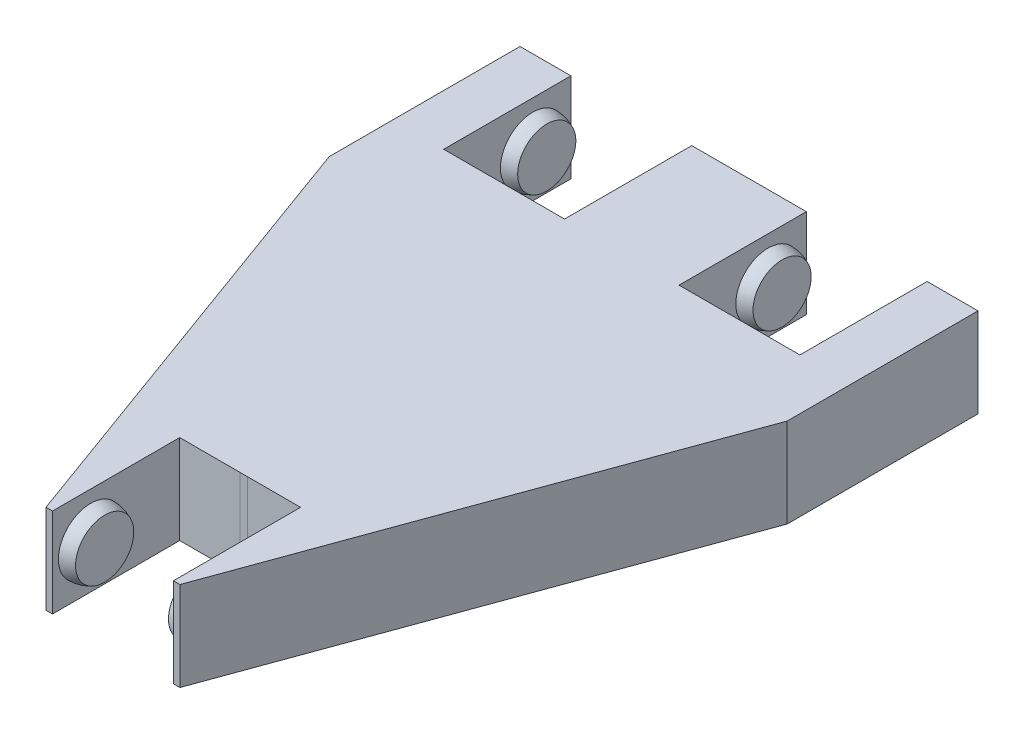
ISO-10303-21;
HEADER;
FILE_DESCRIPTION(('STEP AP214'),'2;1');
FILE_NAME('part.step','',(''),(''),'','','');
FILE_SCHEMA(('AUTOMOTIVE_DESIGN { 1 0 10303 214 1 1 1 1 }'));
ENDSEC;
DATA;
#1=APPLICATION_CONTEXT('core data for automotive mechanical design processes');
#2=APPLICATION_PROTOCOL_DEFINITION('international standard','automotive_design',2000,#1);
#3=PRODUCT_CONTEXT('',#1,'mechanical');
#4=PRODUCT('Part','Part','',(#3));
#5=PRODUCT_RELATED_PRODUCT_CATEGORY('part','',(#4));
#6=PRODUCT_DEFINITION_FORMATION('','',#4);
#7=PRODUCT_DEFINITION_CONTEXT('part definition',#1,'design');
#8=PRODUCT_DEFINITION('design','',#6,#7);
#9=PRODUCT_DEFINITION_SHAPE('','',#8);
#10=(LENGTH_UNIT() NAMED_UNIT(*) SI_UNIT(.MILLI.,.METRE.));
#11=(NAMED_UNIT(*) PLANE_ANGLE_UNIT() SI_UNIT($,.RADIAN.));
#12=(NAMED_UNIT(*) SI_UNIT($,.STERADIAN.) SOLID_ANGLE_UNIT());
#13=UNCERTAINTY_MEASURE_WITH_UNIT(LENGTH_MEASURE(1.E-05),#10,'distance_accuracy_value','');
#14=(GEOMETRIC_REPRESENTATION_CONTEXT(3) GLOBAL_UNCERTAINTY_ASSIGNED_CONTEXT((#13)) GLOBAL_UNIT_ASSIGNED_CONTEXT((#10,
#11,#12)) REPRESENTATION_CONTEXT('',''));
#15=CARTESIAN_POINT('',(0.,0.,0.));
#16=DIRECTION('',(0.,0.,1.));
#17=DIRECTION('',(1.,0.,0.));
#18=AXIS2_PLACEMENT_3D('',#15,#16,#17);
#19=CARTESIAN_POINT('',(0.,14.0277716506636,-30.));
#20=DIRECTION('',(0.,0.,-1.));
#21=DIRECTION('',(-1.,0.,0.));
#22=AXIS2_PLACEMENT_3D('',#19,#20,#21);
#23=PLANE('',#22);
#24=DIRECTION('',(1.,0.,0.));
#25=VECTOR('',#24,1.);
#26=CARTESIAN_POINT('',(0.,0.,-30.));
#27=LINE('',#26,#25);
#28=CARTESIAN_POINT('',(18.5,0.,-30.));
#29=VERTEX_POINT('',#28);
#30=CARTESIAN_POINT('',(28.,0.,-30.));
#31=VERTEX_POINT('',#30);
#32=EDGE_CURVE('E369',#29,#31,#27,.T.);
#33=ORIENTED_EDGE('',*,*,#32,.F.);
#34=DIRECTION('',(0.,-1.,0.));
#35=VECTOR('',#34,1.);
#36=CARTESIAN_POINT('',(18.5,0.,-30.));
#37=LINE('',#36,#35);
#38=CARTESIAN_POINT('',(18.5,14.0277716506636,-30.));
#39=VERTEX_POINT('',#38);
#40=EDGE_CURVE('E56',#39,#29,#37,.T.);
#41=ORIENTED_EDGE('',*,*,#40,.F.);
#42=DIRECTION('',(1.,0.,0.));
#43=VECTOR('',#42,1.);
#44=CARTESIAN_POINT('',(0.,14.0277716506636,-30.));
#45=LINE('',#44,#43);
#46=CARTESIAN_POINT('',(28.,14.0277716506636,-30.));
#47=VERTEX_POINT('',#46);
#48=EDGE_CURVE('E328',#39,#47,#45,.T.);
#49=ORIENTED_EDGE('',*,*,#48,.T.);
#50=DIRECTION('',(0.,-1.,0.));
#51=VECTOR('',#50,1.);
#52=CARTESIAN_POINT('',(28.,14.0277716506636,-30.));
#53=LINE('',#52,#51);
#54=EDGE_CURVE('E406',#47,#31,#53,.T.);
#55=ORIENTED_EDGE('',*,*,#54,.T.);
#56=EDGE_LOOP('',(#33,#41,#49,#55));
#57=FACE_BOUND('',#56,.T.);
#58=ADVANCED_FACE('F38',(#57),#23,.T.);
#59=CARTESIAN_POINT('',(8.99999999999998,14.0277716506636,-30.));
#60=VERTEX_POINT('',#59);
#61=CARTESIAN_POINT('',(16.6931524825552,14.0277716506636,-30.));
#62=VERTEX_POINT('',#61);
#63=EDGE_CURVE('E329',#60,#62,#45,.T.);
#64=ORIENTED_EDGE('',*,*,#63,.T.);
#65=DIRECTION('',(0.,1.,0.));
#66=VECTOR('',#65,1.);
#67=CARTESIAN_POINT('',(16.6931524825552,0.,-30.));
#68=LINE('',#67,#66);
#69=CARTESIAN_POINT('',(16.6931524825552,0.,-30.));
#70=VERTEX_POINT('',#69);
#71=EDGE_CURVE('E245',#70,#62,#68,.T.);
#72=ORIENTED_EDGE('',*,*,#71,.F.);
#73=CARTESIAN_POINT('',(8.99999999999998,0.,-30.));
#74=VERTEX_POINT('',#73);
#75=EDGE_CURVE('E370',#74,#70,#27,.T.);
#76=ORIENTED_EDGE('',*,*,#75,.F.);
#77=DIRECTION('',(0.,-1.,0.));
#78=VECTOR('',#77,1.);
#79=CARTESIAN_POINT('',(8.99999999999998,14.0277716506636,-30.));
#80=LINE('',#79,#78);
#81=EDGE_CURVE('E404',#60,#74,#80,.T.);
#82=ORIENTED_EDGE('',*,*,#81,.F.);
#83=EDGE_LOOP('',(#64,#72,#76,#82));
#84=FACE_BOUND('',#83,.T.);
#85=ADVANCED_FACE('F475',(#84),#23,.T.);
#86=CARTESIAN_POINT('',(0.,14.0277716506636,30.));
#87=DIRECTION('',(0.,0.,-1.));
#88=DIRECTION('',(-1.,0.,0.));
#89=AXIS2_PLACEMENT_3D('',#86,#87,#88);
#90=PLANE('',#89);
#91=DIRECTION('',(0.,-1.,0.));
#92=VECTOR('',#91,1.);
#93=CARTESIAN_POINT('',(0.,0.,30.));
#94=LINE('',#93,#92);
#95=CARTESIAN_POINT('',(0.,14.0277716506636,30.));
#96=VERTEX_POINT('',#95);
#97=CARTESIAN_POINT('',(0.,0.,30.));
#98=VERTEX_POINT('',#97);
#99=EDGE_CURVE('E251',#96,#98,#94,.T.);
#100=ORIENTED_EDGE('',*,*,#99,.F.);
#101=DIRECTION('',(1.,0.,0.));
#102=VECTOR('',#101,1.);
#103=CARTESIAN_POINT('',(0.,14.0277716506636,30.));
#104=LINE('',#103,#102);
#105=CARTESIAN_POINT('',(-9.50000000000001,14.0277716506636,30.));
#106=VERTEX_POINT('',#105);
#107=EDGE_CURVE('E308',#106,#96,#104,.T.);
#108=ORIENTED_EDGE('',*,*,#107,.F.);
#109=DIRECTION('',(0.,-1.,0.));
#110=VECTOR('',#109,1.);
#111=CARTESIAN_POINT('',(-9.50000000000001,14.0277716506636,30.));
#112=LINE('',#111,#110);
#113=CARTESIAN_POINT('',(-9.50000000000001,0.,30.));
#114=VERTEX_POINT('',#113);
#115=EDGE_CURVE('E349',#106,#114,#112,.T.);
#116=ORIENTED_EDGE('',*,*,#115,.T.);
#117=DIRECTION('',(1.,0.,0.));
#118=VECTOR('',#117,1.);
#119=CARTESIAN_POINT('',(0.,0.,30.));
#120=LINE('',#119,#118);
#121=EDGE_CURVE('E350',#114,#98,#120,.T.);
#122=ORIENTED_EDGE('',*,*,#121,.T.);
#123=EDGE_LOOP('',(#100,#108,#116,#122));
#124=FACE_BOUND('',#123,.T.);
#125=ADVANCED_FACE('F533',(#124),#90,.F.);
#126=DIRECTION('',(0.,1.,0.));
#127=VECTOR('',#126,1.);
#128=CARTESIAN_POINT('',(1.17348844516878,0.,30.));
#129=LINE('',#128,#127);
#130=CARTESIAN_POINT('',(1.17348844516878,0.,30.));
#131=VERTEX_POINT('',#130);
#132=CARTESIAN_POINT('',(1.17348844516878,14.0277716506636,30.));
#133=VERTEX_POINT('',#132);
#134=EDGE_CURVE('E261',#131,#133,#129,.T.);
#135=ORIENTED_EDGE('',*,*,#134,.F.);
#136=CARTESIAN_POINT('',(9.49999999999999,0.,30.));
#137=VERTEX_POINT('',#136);
#138=EDGE_CURVE('E307',#131,#137,#120,.T.);
#139=ORIENTED_EDGE('',*,*,#138,.T.);
#140=DIRECTION('',(0.,-1.,0.));
#141=VECTOR('',#140,1.);
#142=CARTESIAN_POINT('',(9.49999999999999,14.0277716506636,30.));
#143=LINE('',#142,#141);
#144=CARTESIAN_POINT('',(9.49999999999999,14.0277716506636,30.));
#145=VERTEX_POINT('',#144);
#146=EDGE_CURVE('E416',#145,#137,#143,.T.);
#147=ORIENTED_EDGE('',*,*,#146,.F.);
#148=EDGE_CURVE('E64',#133,#145,#104,.T.);
#149=ORIENTED_EDGE('',*,*,#148,.F.);
#150=EDGE_LOOP('',(#135,#139,#147,#149));
#151=FACE_BOUND('',#150,.T.);
#152=ADVANCED_FACE('F551',(#151),#90,.F.);
#153=CARTESIAN_POINT('',(0.,14.0277716506636,-50.));
#154=DIRECTION('',(0.,0.,-1.));
#155=DIRECTION('',(-1.,0.,0.));
#156=AXIS2_PLACEMENT_3D('',#153,#154,#155);
#157=PLANE('',#156);
#158=DIRECTION('',(1.,0.,0.));
#159=VECTOR('',#158,1.);
#160=CARTESIAN_POINT('',(0.,14.0277716506636,-50.));
#161=LINE('',#160,#159);
#162=CARTESIAN_POINT('',(-9.00000000000001,14.0277716506636,-50.));
#163=VERTEX_POINT('',#162);
#164=CARTESIAN_POINT('',(0.,14.0277716506636,-50.));
#165=VERTEX_POINT('',#164);
#166=EDGE_CURVE('E325',#163,#165,#161,.T.);
#167=ORIENTED_EDGE('',*,*,#166,.T.);
#168=DIRECTION('',(0.,1.,0.));
#169=VECTOR('',#168,1.);
#170=CARTESIAN_POINT('',(0.,14.0277716506636,-50.));
#171=LINE('',#170,#169);
#172=CARTESIAN_POINT('',(0.,0.,-50.));
#173=VERTEX_POINT('',#172);
#174=EDGE_CURVE('E282',#173,#165,#171,.T.);
#175=ORIENTED_EDGE('',*,*,#174,.F.);
#176=DIRECTION('',(1.,0.,0.));
#177=VECTOR('',#176,1.);
#178=CARTESIAN_POINT('',(0.,0.,-50.));
#179=LINE('',#178,#177);
#180=CARTESIAN_POINT('',(-9.00000000000001,0.,-50.));
#181=VERTEX_POINT('',#180);
#182=EDGE_CURVE('E366',#181,#173,#179,.T.);
#183=ORIENTED_EDGE('',*,*,#182,.F.);
#184=DIRECTION('',(0.,-1.,0.));
#185=VECTOR('',#184,1.);
#186=CARTESIAN_POINT('',(-9.00000000000001,14.0277716506636,-50.));
#187=LINE('',#186,#185);
#188=EDGE_CURVE('E402',#163,#181,#187,.T.);
#189=ORIENTED_EDGE('',*,*,#188,.F.);
#190=EDGE_LOOP('',(#167,#175,#183,#189));
#191=FACE_BOUND('',#190,.T.);
#192=ADVANCED_FACE('F512',(#191),#157,.T.);
#193=CARTESIAN_POINT('',(9.49999999999998,14.0277716506636,0.));
#194=DIRECTION('',(1.,0.,0.));
#195=DIRECTION('',(0.,0.,-1.));
#196=AXIS2_PLACEMENT_3D('',#193,#194,#195);
#197=PLANE('',#196);
#198=CARTESIAN_POINT('',(9.49999999999999,7.,44.));
#199=DIRECTION('',(1.,0.,0.));
#200=DIRECTION('',(0.,0.,-1.));
#201=AXIS2_PLACEMENT_3D('',#198,#199,#200);
#202=CIRCLE('',#201,5.075);
#203=CARTESIAN_POINT('',(9.49999999999999,7.,38.925));
#204=VERTEX_POINT('',#203);
#205=EDGE_CURVE('E48',#204,#204,#202,.F.);
#206=ORIENTED_EDGE('',*,*,#205,.F.);
#207=EDGE_LOOP('',(#206));
#208=FACE_BOUND('',#207,.T.);
#209=DIRECTION('',(0.,0.,1.));
#210=VECTOR('',#209,1.);
#211=CARTESIAN_POINT('',(9.49999999999998,0.,0.));
#212=LINE('',#211,#210);
#213=CARTESIAN_POINT('',(9.49999999999999,0.,50.));
#214=VERTEX_POINT('',#213);
#215=EDGE_CURVE('E352',#137,#214,#212,.T.);
#216=ORIENTED_EDGE('',*,*,#215,.T.);
#217=DIRECTION('',(0.,-1.,0.));
#218=VECTOR('',#217,1.);
#219=CARTESIAN_POINT('',(9.49999999999999,14.0277716506636,50.));
#220=LINE('',#219,#218);
#221=CARTESIAN_POINT('',(9.49999999999999,14.0277716506636,50.));
#222=VERTEX_POINT('',#221);
#223=EDGE_CURVE('E413',#222,#214,#220,.T.);
#224=ORIENTED_EDGE('',*,*,#223,.F.);
#225=DIRECTION('',(0.,0.,1.));
#226=VECTOR('',#225,1.);
#227=CARTESIAN_POINT('',(9.49999999999998,14.0277716506636,0.));
#228=LINE('',#227,#226);
#229=EDGE_CURVE('E311',#145,#222,#228,.T.);
#230=ORIENTED_EDGE('',*,*,#229,.F.);
#231=ORIENTED_EDGE('',*,*,#146,.T.);
#232=EDGE_LOOP('',(#216,#224,#230,#231));
#233=FACE_BOUND('',#232,.T.);
#234=ADVANCED_FACE('F546',(#208,#233),#197,.F.);
#235=CARTESIAN_POINT('',(0.,14.0277716506636,50.));
#236=DIRECTION('',(0.,0.,-1.));
#237=DIRECTION('',(-1.,0.,0.));
#238=AXIS2_PLACEMENT_3D('',#235,#236,#237);
#239=PLANE('',#238);
#240=DIRECTION('',(1.,0.,0.));
#241=VECTOR('',#240,1.);
#242=CARTESIAN_POINT('',(0.,0.,50.));
#243=LINE('',#242,#241);
#244=CARTESIAN_POINT('',(10.5220836013658,0.,50.));
#245=VERTEX_POINT('',#244);
#246=EDGE_CURVE('E354',#214,#245,#243,.T.);
#247=ORIENTED_EDGE('',*,*,#246,.T.);
#248=DIRECTION('',(0.,1.,0.));
#249=VECTOR('',#248,1.);
#250=CARTESIAN_POINT('',(10.5220836013658,14.0277716506636,50.));
#251=LINE('',#250,#249);
#252=CARTESIAN_POINT('',(10.5220836013658,14.0277716506636,50.));
#253=VERTEX_POINT('',#252);
#254=EDGE_CURVE('E424',#245,#253,#251,.T.);
#255=ORIENTED_EDGE('',*,*,#254,.T.);
#256=DIRECTION('',(1.,0.,0.));
#257=VECTOR('',#256,1.);
#258=CARTESIAN_POINT('',(0.,14.0277716506636,50.));
#259=LINE('',#258,#257);
#260=EDGE_CURVE('E313',#222,#253,#259,.T.);
#261=ORIENTED_EDGE('',*,*,#260,.F.);
#262=ORIENTED_EDGE('',*,*,#223,.T.);
#263=EDGE_LOOP('',(#247,#255,#261,#262));
#264=FACE_BOUND('',#263,.T.);
#265=ADVANCED_FACE('F544',(#264),#239,.F.);
#266=CARTESIAN_POINT('',(36.,14.0277716506636,0.));
#267=DIRECTION('',(1.,0.,0.));
#268=DIRECTION('',(0.,0.,-1.));
#269=AXIS2_PLACEMENT_3D('',#266,#267,#268);
#270=PLANE('',#269);
#271=DIRECTION('',(0.,0.,1.));
#272=VECTOR('',#271,1.);
#273=CARTESIAN_POINT('',(36.,14.0277716506636,0.));
#274=LINE('',#273,#272);
#275=CARTESIAN_POINT('',(36.,14.0277716506636,-50.));
#276=VERTEX_POINT('',#275);
#277=CARTESIAN_POINT('',(36.,14.0277716506636,-20.0000000000006));
#278=VERTEX_POINT('',#277);
#279=EDGE_CURVE('E316',#276,#278,#274,.T.);
#280=ORIENTED_EDGE('',*,*,#279,.T.);
#281=DIRECTION('',(0.,-1.,0.));
#282=VECTOR('',#281,1.);
#283=CARTESIAN_POINT('',(36.,0.,-20.0000000000006));
#284=LINE('',#283,#282);
#285=CARTESIAN_POINT('',(36.,0.,-20.0000000000006));
#286=VERTEX_POINT('',#285);
#287=EDGE_CURVE('E419',#278,#286,#284,.T.);
#288=ORIENTED_EDGE('',*,*,#287,.T.);
#289=DIRECTION('',(0.,0.,1.));
#290=VECTOR('',#289,1.);
#291=CARTESIAN_POINT('',(36.,0.,0.));
#292=LINE('',#291,#290);
#293=CARTESIAN_POINT('',(36.,0.,-50.));
#294=VERTEX_POINT('',#293);
#295=EDGE_CURVE('E357',#294,#286,#292,.T.);
#296=ORIENTED_EDGE('',*,*,#295,.F.);
#297=DIRECTION('',(0.,-1.,0.));
#298=VECTOR('',#297,1.);
#299=CARTESIAN_POINT('',(36.,14.0277716506636,-50.));
#300=LINE('',#299,#298);
#301=EDGE_CURVE('E411',#276,#294,#300,.T.);
#302=ORIENTED_EDGE('',*,*,#301,.F.);
#303=EDGE_LOOP('',(#280,#288,#296,#302));
#304=FACE_BOUND('',#303,.T.);
#305=ADVANCED_FACE('F541',(#304),#270,.T.);
#306=CARTESIAN_POINT('',(28.,0.,-50.));
#307=VERTEX_POINT('',#306);
#308=EDGE_CURVE('E361',#307,#294,#179,.T.);
#309=ORIENTED_EDGE('',*,*,#308,.F.);
#310=DIRECTION('',(0.,-1.,0.));
#311=VECTOR('',#310,1.);
#312=CARTESIAN_POINT('',(28.,14.0277716506636,-50.));
#313=LINE('',#312,#311);
#314=CARTESIAN_POINT('',(28.,14.0277716506636,-50.));
#315=VERTEX_POINT('',#314);
#316=EDGE_CURVE('E409',#315,#307,#313,.T.);
#317=ORIENTED_EDGE('',*,*,#316,.F.);
#318=EDGE_CURVE('E320',#315,#276,#161,.T.);
#319=ORIENTED_EDGE('',*,*,#318,.T.);
#320=ORIENTED_EDGE('',*,*,#301,.T.);
#321=EDGE_LOOP('',(#309,#317,#319,#320));
#322=FACE_BOUND('',#321,.T.);
#323=ADVANCED_FACE('F539',(#322),#157,.T.);
#324=CARTESIAN_POINT('',(28.,14.0277716506636,0.));
#325=DIRECTION('',(1.,0.,0.));
#326=DIRECTION('',(0.,0.,-1.));
#327=AXIS2_PLACEMENT_3D('',#324,#325,#326);
#328=PLANE('',#327);
#329=CARTESIAN_POINT('',(28.,7.,-44.));
#330=DIRECTION('',(1.,0.,0.));
#331=DIRECTION('',(0.,0.,-1.));
#332=AXIS2_PLACEMENT_3D('',#329,#330,#331);
#333=CIRCLE('',#332,5.075);
#334=CARTESIAN_POINT('',(28.,7.,-49.075));
#335=VERTEX_POINT('',#334);
#336=EDGE_CURVE('E437',#335,#335,#333,.F.);
#337=ORIENTED_EDGE('',*,*,#336,.F.);
#338=EDGE_LOOP('',(#337));
#339=FACE_BOUND('',#338,.T.);
#340=DIRECTION('',(0.,0.,1.));
#341=VECTOR('',#340,1.);
#342=CARTESIAN_POINT('',(28.,0.,0.));
#343=LINE('',#342,#341);
#344=EDGE_CURVE('E364',#307,#31,#343,.T.);
#345=ORIENTED_EDGE('',*,*,#344,.T.);
#346=ORIENTED_EDGE('',*,*,#54,.F.);
#347=DIRECTION('',(0.,0.,1.));
#348=VECTOR('',#347,1.);
#349=CARTESIAN_POINT('',(28.,14.0277716506636,0.));
#350=LINE('',#349,#348);
#351=EDGE_CURVE('E323',#315,#47,#350,.T.);
#352=ORIENTED_EDGE('',*,*,#351,.F.);
#353=ORIENTED_EDGE('',*,*,#316,.T.);
#354=EDGE_LOOP('',(#345,#346,#352,#353));
#355=FACE_BOUND('',#354,.T.);
#356=ADVANCED_FACE('F536',(#339,#355),#328,.F.);
#357=CARTESIAN_POINT('',(8.99999999999999,14.0277716506636,0.));
#358=DIRECTION('',(1.,0.,0.));
#359=DIRECTION('',(0.,0.,-1.));
#360=AXIS2_PLACEMENT_3D('',#357,#358,#359);
#361=PLANE('',#360);
#362=CARTESIAN_POINT('',(8.99999999999995,7.,-44.));
#363=DIRECTION('',(-1.,0.,0.));
#364=DIRECTION('',(0.,0.,1.));
#365=AXIS2_PLACEMENT_3D('',#362,#363,#364);
#366=CIRCLE('',#365,5.075);
#367=CARTESIAN_POINT('',(8.99999999999995,7.,-38.925));
#368=VERTEX_POINT('',#367);
#369=EDGE_CURVE('E454',#368,#368,#366,.T.);
#370=ORIENTED_EDGE('',*,*,#369,.T.);
#371=EDGE_LOOP('',(#370));
#372=FACE_BOUND('',#371,.T.);
#373=DIRECTION('',(0.,0.,1.));
#374=VECTOR('',#373,1.);
#375=CARTESIAN_POINT('',(8.99999999999999,0.,0.));
#376=LINE('',#375,#374);
#377=CARTESIAN_POINT('',(8.99999999999998,0.,-50.01));
#378=VERTEX_POINT('',#377);
#379=EDGE_CURVE('E372',#378,#74,#376,.T.);
#380=ORIENTED_EDGE('',*,*,#379,.F.);
#381=DIRECTION('',(0.,-1.,0.));
#382=VECTOR('',#381,1.);
#383=CARTESIAN_POINT('',(8.99999999999998,14.0277716506636,-50.01));
#384=LINE('',#383,#382);
#385=CARTESIAN_POINT('',(8.99999999999998,14.0277716506636,-50.01));
#386=VERTEX_POINT('',#385);
#387=EDGE_CURVE('E289',#386,#378,#384,.T.);
#388=ORIENTED_EDGE('',*,*,#387,.F.);
#389=DIRECTION('',(0.,0.,1.));
#390=VECTOR('',#389,1.);
#391=CARTESIAN_POINT('',(8.99999999999999,14.0277716506636,0.));
#392=LINE('',#391,#390);
#393=EDGE_CURVE('E332',#386,#60,#392,.T.);
#394=ORIENTED_EDGE('',*,*,#393,.T.);
#395=ORIENTED_EDGE('',*,*,#81,.T.);
#396=EDGE_LOOP('',(#380,#388,#394,#395));
#397=FACE_BOUND('',#396,.T.);
#398=ADVANCED_FACE('F478',(#372,#397),#361,.T.);
#399=CARTESIAN_POINT('',(-9.00000000000001,14.0277716506636,0.));
#400=DIRECTION('',(1.,0.,0.));
#401=DIRECTION('',(0.,0.,-1.));
#402=AXIS2_PLACEMENT_3D('',#399,#400,#401);
#403=PLANE('',#402);
#404=CARTESIAN_POINT('',(-9.00000000000001,7.,-44.));
#405=DIRECTION('',(1.,0.,0.));
#406=DIRECTION('',(0.,0.,-1.));
#407=AXIS2_PLACEMENT_3D('',#404,#405,#406);
#408=CIRCLE('',#407,5.075);
#409=CARTESIAN_POINT('',(-9.00000000000001,7.,-49.075));
#410=VERTEX_POINT('',#409);
#411=EDGE_CURVE('E11',#410,#410,#408,.F.);
#412=ORIENTED_EDGE('',*,*,#411,.F.);
#413=EDGE_LOOP('',(#412));
#414=FACE_BOUND('',#413,.T.);
#415=DIRECTION('',(0.,0.,1.));
#416=VECTOR('',#415,1.);
#417=CARTESIAN_POINT('',(-9.00000000000001,0.,0.));
#418=LINE('',#417,#416);
#419=CARTESIAN_POINT('',(-9.00000000000001,0.,-30.));
#420=VERTEX_POINT('',#419);
#421=EDGE_CURVE('E375',#181,#420,#418,.T.);
#422=ORIENTED_EDGE('',*,*,#421,.T.);
#423=DIRECTION('',(0.,-1.,0.));
#424=VECTOR('',#423,1.);
#425=CARTESIAN_POINT('',(-9.00000000000001,14.0277716506636,-30.));
#426=LINE('',#425,#424);
#427=CARTESIAN_POINT('',(-9.00000000000001,14.0277716506636,-30.));
#428=VERTEX_POINT('',#427);
#429=EDGE_CURVE('E400',#428,#420,#426,.T.);
#430=ORIENTED_EDGE('',*,*,#429,.F.);
#431=DIRECTION('',(0.,0.,1.));
#432=VECTOR('',#431,1.);
#433=CARTESIAN_POINT('',(-9.00000000000001,14.0277716506636,0.));
#434=LINE('',#433,#432);
#435=EDGE_CURVE('E335',#163,#428,#434,.T.);
#436=ORIENTED_EDGE('',*,*,#435,.F.);
#437=ORIENTED_EDGE('',*,*,#188,.T.);
#438=EDGE_LOOP('',(#422,#430,#436,#437));
#439=FACE_BOUND('',#438,.T.);
#440=ADVANCED_FACE('F514',(#414,#439),#403,.F.);
#441=CARTESIAN_POINT('',(0.,14.0277716506636,-30.));
#442=DIRECTION('',(0.,0.,-1.));
#443=DIRECTION('',(-1.,0.,0.));
#444=AXIS2_PLACEMENT_3D('',#441,#442,#443);
#445=PLANE('',#444);
#446=DIRECTION('',(1.,0.,0.));
#447=VECTOR('',#446,1.);
#448=CARTESIAN_POINT('',(0.,0.,-30.));
#449=LINE('',#448,#447);
#450=CARTESIAN_POINT('',(-28.,0.,-30.));
#451=VERTEX_POINT('',#450);
#452=EDGE_CURVE('E378',#451,#420,#449,.T.);
#453=ORIENTED_EDGE('',*,*,#452,.F.);
#454=DIRECTION('',(0.,-1.,0.));
#455=VECTOR('',#454,1.);
#456=CARTESIAN_POINT('',(-28.,14.0277716506636,-30.));
#457=LINE('',#456,#455);
#458=CARTESIAN_POINT('',(-28.,14.0277716506636,-30.));
#459=VERTEX_POINT('',#458);
#460=EDGE_CURVE('E398',#459,#451,#457,.T.);
#461=ORIENTED_EDGE('',*,*,#460,.F.);
#462=DIRECTION('',(1.,0.,0.));
#463=VECTOR('',#462,1.);
#464=CARTESIAN_POINT('',(0.,14.0277716506636,-30.));
#465=LINE('',#464,#463);
#466=EDGE_CURVE('E337',#459,#428,#465,.T.);
#467=ORIENTED_EDGE('',*,*,#466,.T.);
#468=ORIENTED_EDGE('',*,*,#429,.T.);
#469=EDGE_LOOP('',(#453,#461,#467,#468));
#470=FACE_BOUND('',#469,.T.);
#471=ADVANCED_FACE('F516',(#470),#445,.T.);
#472=CARTESIAN_POINT('',(-28.,14.0277716506636,0.));
#473=DIRECTION('',(1.,0.,0.));
#474=DIRECTION('',(0.,0.,-1.));
#475=AXIS2_PLACEMENT_3D('',#472,#473,#474);
#476=PLANE('',#475);
#477=CARTESIAN_POINT('',(-28.,7.,-44.));
#478=DIRECTION('',(-1.,0.,0.));
#479=DIRECTION('',(0.,0.,1.));
#480=AXIS2_PLACEMENT_3D('',#477,#478,#479);
#481=CIRCLE('',#480,5.075);
#482=CARTESIAN_POINT('',(-28.,7.,-38.925));
#483=VERTEX_POINT('',#482);
#484=EDGE_CURVE('E300',#483,#483,#481,.T.);
#485=ORIENTED_EDGE('',*,*,#484,.T.);
#486=EDGE_LOOP('',(#485));
#487=FACE_BOUND('',#486,.T.);
#488=DIRECTION('',(0.,0.,1.));
#489=VECTOR('',#488,1.);
#490=CARTESIAN_POINT('',(-28.,0.,0.));
#491=LINE('',#490,#489);
#492=CARTESIAN_POINT('',(-28.,0.,-50.));
#493=VERTEX_POINT('',#492);
#494=EDGE_CURVE('E381',#493,#451,#491,.T.);
#495=ORIENTED_EDGE('',*,*,#494,.F.);
#496=DIRECTION('',(0.,-1.,0.));
#497=VECTOR('',#496,1.);
#498=CARTESIAN_POINT('',(-28.,14.0277716506636,-50.));
#499=LINE('',#498,#497);
#500=CARTESIAN_POINT('',(-28.,14.0277716506636,-50.));
#501=VERTEX_POINT('',#500);
#502=EDGE_CURVE('E396',#501,#493,#499,.T.);
#503=ORIENTED_EDGE('',*,*,#502,.F.);
#504=DIRECTION('',(0.,0.,1.));
#505=VECTOR('',#504,1.);
#506=CARTESIAN_POINT('',(-28.,14.0277716506636,0.));
#507=LINE('',#506,#505);
#508=EDGE_CURVE('E340',#501,#459,#507,.T.);
#509=ORIENTED_EDGE('',*,*,#508,.T.);
#510=ORIENTED_EDGE('',*,*,#460,.T.);
#511=EDGE_LOOP('',(#495,#503,#509,#510));
#512=FACE_BOUND('',#511,.T.);
#513=ADVANCED_FACE('F505',(#487,#512),#476,.T.);
#514=CARTESIAN_POINT('',(-36.,0.,-50.));
#515=VERTEX_POINT('',#514);
#516=EDGE_CURVE('E365',#515,#493,#179,.T.);
#517=ORIENTED_EDGE('',*,*,#516,.F.);
#518=DIRECTION('',(0.,-1.,0.));
#519=VECTOR('',#518,1.);
#520=CARTESIAN_POINT('',(-36.,14.0277716506636,-50.));
#521=LINE('',#520,#519);
#522=CARTESIAN_POINT('',(-36.,14.0277716506636,-50.));
#523=VERTEX_POINT('',#522);
#524=EDGE_CURVE('E394',#523,#515,#521,.T.);
#525=ORIENTED_EDGE('',*,*,#524,.F.);
#526=EDGE_CURVE('E324',#523,#501,#161,.T.);
#527=ORIENTED_EDGE('',*,*,#526,.T.);
#528=ORIENTED_EDGE('',*,*,#502,.T.);
#529=EDGE_LOOP('',(#517,#525,#527,#528));
#530=FACE_BOUND('',#529,.T.);
#531=ADVANCED_FACE('F499',(#530),#157,.T.);
#532=CARTESIAN_POINT('',(-36.,14.0277716506636,0.));
#533=DIRECTION('',(1.,0.,0.));
#534=DIRECTION('',(0.,0.,-1.));
#535=AXIS2_PLACEMENT_3D('',#532,#533,#534);
#536=PLANE('',#535);
#537=DIRECTION('',(0.,0.,1.));
#538=VECTOR('',#537,1.);
#539=CARTESIAN_POINT('',(-36.,0.,0.));
#540=LINE('',#539,#538);
#541=CARTESIAN_POINT('',(-36.,0.,-20.0000000000007));
#542=VERTEX_POINT('',#541);
#543=EDGE_CURVE('E384',#515,#542,#540,.T.);
#544=ORIENTED_EDGE('',*,*,#543,.T.);
#545=DIRECTION('',(0.,1.,0.));
#546=VECTOR('',#545,1.);
#547=CARTESIAN_POINT('',(-36.,14.0277716506636,-20.0000000000007));
#548=LINE('',#547,#546);
#549=CARTESIAN_POINT('',(-36.,14.0277716506636,-20.0000000000007));
#550=VERTEX_POINT('',#549);
#551=EDGE_CURVE('E433',#542,#550,#548,.T.);
#552=ORIENTED_EDGE('',*,*,#551,.T.);
#553=DIRECTION('',(0.,0.,1.));
#554=VECTOR('',#553,1.);
#555=CARTESIAN_POINT('',(-36.,14.0277716506636,0.));
#556=LINE('',#555,#554);
#557=EDGE_CURVE('E343',#523,#550,#556,.T.);
#558=ORIENTED_EDGE('',*,*,#557,.F.);
#559=ORIENTED_EDGE('',*,*,#524,.T.);
#560=EDGE_LOOP('',(#544,#552,#558,#559));
#561=FACE_BOUND('',#560,.T.);
#562=ADVANCED_FACE('F612',(#561),#536,.F.);
#563=CARTESIAN_POINT('',(-10.5220836013658,14.0277716506636,50.));
#564=VERTEX_POINT('',#563);
#565=CARTESIAN_POINT('',(-9.50000000000001,14.0277716506636,50.));
#566=VERTEX_POINT('',#565);
#567=EDGE_CURVE('E317',#564,#566,#259,.T.);
#568=ORIENTED_EDGE('',*,*,#567,.F.);
#569=DIRECTION('',(0.,-1.,0.));
#570=VECTOR('',#569,1.);
#571=CARTESIAN_POINT('',(-10.5220836013658,14.0277716506636,50.));
#572=LINE('',#571,#570);
#573=CARTESIAN_POINT('',(-10.5220836013658,0.,50.));
#574=VERTEX_POINT('',#573);
#575=EDGE_CURVE('E428',#564,#574,#572,.T.);
#576=ORIENTED_EDGE('',*,*,#575,.T.);
#577=CARTESIAN_POINT('',(-9.50000000000001,0.,50.));
#578=VERTEX_POINT('',#577);
#579=EDGE_CURVE('E358',#574,#578,#243,.T.);
#580=ORIENTED_EDGE('',*,*,#579,.T.);
#581=DIRECTION('',(0.,-1.,0.));
#582=VECTOR('',#581,1.);
#583=CARTESIAN_POINT('',(-9.50000000000001,14.0277716506636,50.));
#584=LINE('',#583,#582);
#585=EDGE_CURVE('E391',#566,#578,#584,.T.);
#586=ORIENTED_EDGE('',*,*,#585,.F.);
#587=EDGE_LOOP('',(#568,#576,#580,#586));
#588=FACE_BOUND('',#587,.T.);
#589=ADVANCED_FACE('F608',(#588),#239,.F.);
#590=CARTESIAN_POINT('',(-9.50000000000002,14.0277716506636,0.));
#591=DIRECTION('',(1.,0.,0.));
#592=DIRECTION('',(0.,0.,-1.));
#593=AXIS2_PLACEMENT_3D('',#590,#591,#592);
#594=PLANE('',#593);
#595=CARTESIAN_POINT('',(-9.50000000000001,7.,44.));
#596=DIRECTION('',(-1.,0.,0.));
#597=DIRECTION('',(0.,0.,-1.));
#598=AXIS2_PLACEMENT_3D('',#595,#596,#597);
#599=CIRCLE('',#598,5.075);
#600=CARTESIAN_POINT('',(-9.50000000000001,7.,38.925));
#601=VERTEX_POINT('',#600);
#602=EDGE_CURVE('E304',#601,#601,#599,.T.);
#603=ORIENTED_EDGE('',*,*,#602,.T.);
#604=EDGE_LOOP('',(#603));
#605=FACE_BOUND('',#604,.T.);
#606=DIRECTION('',(0.,0.,1.));
#607=VECTOR('',#606,1.);
#608=CARTESIAN_POINT('',(-9.50000000000002,0.,0.));
#609=LINE('',#608,#607);
#610=EDGE_CURVE('E387',#114,#578,#609,.T.);
#611=ORIENTED_EDGE('',*,*,#610,.F.);
#612=ORIENTED_EDGE('',*,*,#115,.F.);
#613=DIRECTION('',(0.,0.,1.));
#614=VECTOR('',#613,1.);
#615=CARTESIAN_POINT('',(-9.50000000000002,14.0277716506636,0.));
#616=LINE('',#615,#614);
#617=EDGE_CURVE('E346',#106,#566,#616,.T.);
#618=ORIENTED_EDGE('',*,*,#617,.T.);
#619=ORIENTED_EDGE('',*,*,#585,.T.);
#620=EDGE_LOOP('',(#611,#612,#618,#619));
#621=FACE_BOUND('',#620,.T.);
#622=ADVANCED_FACE('F606',(#605,#621),#594,.T.);
#623=CARTESIAN_POINT('',(0.,14.0277716506636,0.));
#624=DIRECTION('',(0.,1.,0.));
#625=DIRECTION('',(0.,0.,1.));
#626=AXIS2_PLACEMENT_3D('',#623,#624,#625);
#627=PLANE('',#626);
#628=ORIENTED_EDGE('',*,*,#557,.T.);
#629=DIRECTION('',(-0.342020143325666,0.,-0.939692620785909));
#630=VECTOR('',#629,1.);
#631=CARTESIAN_POINT('',(-25.3609238792761,14.0277716506636,9.23062140554737));
#632=LINE('',#631,#630);
#633=EDGE_CURVE('E435',#550,#564,#632,.F.);
#634=ORIENTED_EDGE('',*,*,#633,.T.);
#635=ORIENTED_EDGE('',*,*,#567,.T.);
#636=ORIENTED_EDGE('',*,*,#617,.F.);
#637=ORIENTED_EDGE('',*,*,#107,.T.);
#638=DIRECTION('',(0.,0.,-1.));
#639=VECTOR('',#638,1.);
#640=CARTESIAN_POINT('',(0.,14.0277716506636,30.01));
#641=LINE('',#640,#639);
#642=CARTESIAN_POINT('',(0.,14.0277716506636,30.01));
#643=VERTEX_POINT('',#642);
#644=EDGE_CURVE('E267',#643,#96,#641,.T.);
#645=ORIENTED_EDGE('',*,*,#644,.F.);
#646=DIRECTION('',(-1.,0.,0.));
#647=VECTOR('',#646,1.);
#648=CARTESIAN_POINT('',(0.,14.0277716506636,30.01));
#649=LINE('',#648,#647);
#650=CARTESIAN_POINT('',(1.17348844516878,14.0277716506636,30.01));
#651=VERTEX_POINT('',#650);
#652=EDGE_CURVE('E265',#651,#643,#649,.T.);
#653=ORIENTED_EDGE('',*,*,#652,.F.);
#654=DIRECTION('',(0.,0.,-1.));
#655=VECTOR('',#654,1.);
#656=CARTESIAN_POINT('',(1.17348844516878,14.0277716506636,30.01));
#657=LINE('',#656,#655);
#658=EDGE_CURVE('E273',#651,#133,#657,.T.);
#659=ORIENTED_EDGE('',*,*,#658,.T.);
#660=ORIENTED_EDGE('',*,*,#148,.T.);
#661=ORIENTED_EDGE('',*,*,#229,.T.);
#662=ORIENTED_EDGE('',*,*,#260,.T.);
#663=DIRECTION('',(0.342020143325666,0.,-0.93969262078591));
#664=VECTOR('',#663,1.);
#665=CARTESIAN_POINT('',(25.3609238792761,14.0277716506636,9.23062140554737));
#666=LINE('',#665,#664);
#667=EDGE_CURVE('E426',#253,#278,#666,.T.);
#668=ORIENTED_EDGE('',*,*,#667,.T.);
#669=ORIENTED_EDGE('',*,*,#279,.F.);
#670=ORIENTED_EDGE('',*,*,#318,.F.);
#671=ORIENTED_EDGE('',*,*,#351,.T.);
#672=ORIENTED_EDGE('',*,*,#48,.F.);
#673=DIRECTION('',(0.,0.,1.));
#674=VECTOR('',#673,1.);
#675=CARTESIAN_POINT('',(18.5,14.0277716506636,-30.01));
#676=LINE('',#675,#674);
#677=CARTESIAN_POINT('',(18.5,14.0277716506636,-30.01));
#678=VERTEX_POINT('',#677);
#679=EDGE_CURVE('E464',#678,#39,#676,.T.);
#680=ORIENTED_EDGE('',*,*,#679,.F.);
#681=DIRECTION('',(1.,0.,0.));
#682=VECTOR('',#681,1.);
#683=CARTESIAN_POINT('',(18.5,14.0277716506636,-30.01));
#684=LINE('',#683,#682);
#685=CARTESIAN_POINT('',(16.6931524825552,14.0277716506636,-30.01));
#686=VERTEX_POINT('',#685);
#687=EDGE_CURVE('E243',#686,#678,#684,.T.);
#688=ORIENTED_EDGE('',*,*,#687,.F.);
#689=DIRECTION('',(0.,0.,1.));
#690=VECTOR('',#689,1.);
#691=CARTESIAN_POINT('',(16.6931524825552,14.0277716506636,-30.01));
#692=LINE('',#691,#690);
#693=EDGE_CURVE('E253',#686,#62,#692,.T.);
#694=ORIENTED_EDGE('',*,*,#693,.T.);
#695=ORIENTED_EDGE('',*,*,#63,.F.);
#696=ORIENTED_EDGE('',*,*,#393,.F.);
#697=DIRECTION('',(1.,0.,0.));
#698=VECTOR('',#697,1.);
#699=CARTESIAN_POINT('',(0.,14.0277716506636,-50.01));
#700=LINE('',#699,#698);
#701=CARTESIAN_POINT('',(0.,14.0277716506636,-50.01));
#702=VERTEX_POINT('',#701);
#703=EDGE_CURVE('E286',#702,#386,#700,.T.);
#704=ORIENTED_EDGE('',*,*,#703,.F.);
#705=DIRECTION('',(0.,0.,1.));
#706=VECTOR('',#705,1.);
#707=CARTESIAN_POINT('',(0.,14.0277716506636,-50.01));
#708=LINE('',#707,#706);
#709=EDGE_CURVE('E298',#702,#165,#708,.T.);
#710=ORIENTED_EDGE('',*,*,#709,.T.);
#711=ORIENTED_EDGE('',*,*,#166,.F.);
#712=ORIENTED_EDGE('',*,*,#435,.T.);
#713=ORIENTED_EDGE('',*,*,#466,.F.);
#714=ORIENTED_EDGE('',*,*,#508,.F.);
#715=ORIENTED_EDGE('',*,*,#526,.F.);
#716=EDGE_LOOP('',(#628,#634,#635,#636,#637,#645,#653,#659,#660,#661,#662,#668,#669,#670,#671,
#672,#680,#688,#694,#695,#696,#704,#710,#711,#712,#713,#714,#715));
#717=FACE_BOUND('',#716,.T.);
#718=ADVANCED_FACE('F471',(#717),#627,.T.);
#719=CARTESIAN_POINT('',(0.,0.,0.));
#720=DIRECTION('',(0.,1.,0.));
#721=DIRECTION('',(0.,0.,1.));
#722=AXIS2_PLACEMENT_3D('',#719,#720,#721);
#723=PLANE('',#722);
#724=ORIENTED_EDGE('',*,*,#579,.F.);
#725=DIRECTION('',(0.342020143325666,0.,0.939692620785909));
#726=VECTOR('',#725,1.);
#727=CARTESIAN_POINT('',(-10.5220836013658,0.,50.));
#728=LINE('',#727,#726);
#729=EDGE_CURVE('E431',#574,#542,#728,.F.);
#730=ORIENTED_EDGE('',*,*,#729,.T.);
#731=ORIENTED_EDGE('',*,*,#543,.F.);
#732=ORIENTED_EDGE('',*,*,#516,.T.);
#733=ORIENTED_EDGE('',*,*,#494,.T.);
#734=ORIENTED_EDGE('',*,*,#452,.T.);
#735=ORIENTED_EDGE('',*,*,#421,.F.);
#736=ORIENTED_EDGE('',*,*,#182,.T.);
#737=DIRECTION('',(0.,0.,1.));
#738=VECTOR('',#737,1.);
#739=CARTESIAN_POINT('',(0.,0.,-50.01));
#740=LINE('',#739,#738);
#741=CARTESIAN_POINT('',(0.,0.,-50.01));
#742=VERTEX_POINT('',#741);
#743=EDGE_CURVE('E294',#742,#173,#740,.T.);
#744=ORIENTED_EDGE('',*,*,#743,.F.);
#745=DIRECTION('',(-1.,0.,0.));
#746=VECTOR('',#745,1.);
#747=CARTESIAN_POINT('',(0.,0.,-50.01));
#748=LINE('',#747,#746);
#749=EDGE_CURVE('E292',#378,#742,#748,.T.);
#750=ORIENTED_EDGE('',*,*,#749,.F.);
#751=ORIENTED_EDGE('',*,*,#379,.T.);
#752=ORIENTED_EDGE('',*,*,#75,.T.);
#753=DIRECTION('',(0.,0.,1.));
#754=VECTOR('',#753,1.);
#755=CARTESIAN_POINT('',(16.6931524825552,0.,-30.01));
#756=LINE('',#755,#754);
#757=CARTESIAN_POINT('',(16.6931524825552,0.,-30.01));
#758=VERTEX_POINT('',#757);
#759=EDGE_CURVE('E234',#758,#70,#756,.T.);
#760=ORIENTED_EDGE('',*,*,#759,.F.);
#761=DIRECTION('',(-1.,0.,0.));
#762=VECTOR('',#761,1.);
#763=CARTESIAN_POINT('',(18.5,0.,-30.01));
#764=LINE('',#763,#762);
#765=CARTESIAN_POINT('',(18.5,0.,-30.01));
#766=VERTEX_POINT('',#765);
#767=EDGE_CURVE('E227',#766,#758,#764,.T.);
#768=ORIENTED_EDGE('',*,*,#767,.F.);
#769=DIRECTION('',(0.,0.,1.));
#770=VECTOR('',#769,1.);
#771=CARTESIAN_POINT('',(18.5,0.,-30.01));
#772=LINE('',#771,#770);
#773=EDGE_CURVE('E231',#766,#29,#772,.T.);
#774=ORIENTED_EDGE('',*,*,#773,.T.);
#775=ORIENTED_EDGE('',*,*,#32,.T.);
#776=ORIENTED_EDGE('',*,*,#344,.F.);
#777=ORIENTED_EDGE('',*,*,#308,.T.);
#778=ORIENTED_EDGE('',*,*,#295,.T.);
#779=DIRECTION('',(-0.342020143325666,0.,0.93969262078591));
#780=VECTOR('',#779,1.);
#781=CARTESIAN_POINT('',(36.,0.,-20.0000000000006));
#782=LINE('',#781,#780);
#783=EDGE_CURVE('E422',#286,#245,#782,.T.);
#784=ORIENTED_EDGE('',*,*,#783,.T.);
#785=ORIENTED_EDGE('',*,*,#246,.F.);
#786=ORIENTED_EDGE('',*,*,#215,.F.);
#787=ORIENTED_EDGE('',*,*,#138,.F.);
#788=DIRECTION('',(0.,0.,-1.));
#789=VECTOR('',#788,1.);
#790=CARTESIAN_POINT('',(1.17348844516878,0.,30.01));
#791=LINE('',#790,#789);
#792=CARTESIAN_POINT('',(1.17348844516878,0.,30.01));
#793=VERTEX_POINT('',#792);
#794=EDGE_CURVE('E276',#793,#131,#791,.T.);
#795=ORIENTED_EDGE('',*,*,#794,.F.);
#796=DIRECTION('',(1.,0.,0.));
#797=VECTOR('',#796,1.);
#798=CARTESIAN_POINT('',(0.,0.,30.01));
#799=LINE('',#798,#797);
#800=CARTESIAN_POINT('',(0.,0.,30.01));
#801=VERTEX_POINT('',#800);
#802=EDGE_CURVE('E260',#801,#793,#799,.T.);
#803=ORIENTED_EDGE('',*,*,#802,.F.);
#804=DIRECTION('',(0.,0.,-1.));
#805=VECTOR('',#804,1.);
#806=CARTESIAN_POINT('',(0.,0.,30.01));
#807=LINE('',#806,#805);
#808=EDGE_CURVE('E279',#801,#98,#807,.T.);
#809=ORIENTED_EDGE('',*,*,#808,.T.);
#810=ORIENTED_EDGE('',*,*,#121,.F.);
#811=ORIENTED_EDGE('',*,*,#610,.T.);
#812=EDGE_LOOP('',(#724,#730,#731,#732,#733,#734,#735,#736,#744,#750,#751,#752,#760,#768,#774,
#775,#776,#777,#778,#784,#785,#786,#787,#795,#803,#809,#810,#811));
#813=FACE_BOUND('',#812,.T.);
#814=ADVANCED_FACE('F230',(#813),#723,.F.);
#815=CARTESIAN_POINT('',(36.,14.0277716506636,-20.0000000000006));
#816=DIRECTION('',(0.939692620785909,0.,0.342020143325666));
#817=DIRECTION('',(0.,1.,0.));
#818=AXIS2_PLACEMENT_3D('',#815,#816,#817);
#819=PLANE('',#818);
#820=ORIENTED_EDGE('',*,*,#667,.F.);
#821=ORIENTED_EDGE('',*,*,#254,.F.);
#822=ORIENTED_EDGE('',*,*,#783,.F.);
#823=ORIENTED_EDGE('',*,*,#287,.F.);
#824=EDGE_LOOP('',(#820,#821,#822,#823));
#825=FACE_BOUND('',#824,.T.);
#826=ADVANCED_FACE('F554',(#825),#819,.T.);
#827=CARTESIAN_POINT('',(-10.5220836013658,14.0277716506636,50.));
#828=DIRECTION('',(0.939692620785909,0.,-0.342020143325666));
#829=DIRECTION('',(0.,-1.,0.));
#830=AXIS2_PLACEMENT_3D('',#827,#828,#829);
#831=PLANE('',#830);
#832=ORIENTED_EDGE('',*,*,#633,.F.);
#833=ORIENTED_EDGE('',*,*,#551,.F.);
#834=ORIENTED_EDGE('',*,*,#729,.F.);
#835=ORIENTED_EDGE('',*,*,#575,.F.);
#836=EDGE_LOOP('',(#832,#833,#834,#835));
#837=FACE_BOUND('',#836,.T.);
#838=ADVANCED_FACE('F41',(#837),#831,.F.);
#839=CARTESIAN_POINT('',(-9.50000000000001,7.,44.));
#840=DIRECTION('',(0.,0.,1.));
#841=DIRECTION('',(0.,-1.,0.));
#842=AXIS2_PLACEMENT_3D('',#839,#840,#841);
#843=SPHERICAL_SURFACE('',#842,5.075);
#844=CARTESIAN_POINT('',(-9.50000000000001,7.,44.));
#845=DIRECTION('',(-1.,0.,0.));
#846=DIRECTION('',(0.,-1.,0.));
#847=AXIS2_PLACEMENT_3D('',#844,#845,#846);
#848=SPHERICAL_SURFACE('',#847,5.075);
#849=CARTESIAN_POINT('',(-7.3,7.,44.));
#850=DIRECTION('',(-1.,0.,0.));
#851=DIRECTION('',(0.,-1.,0.));
#852=AXIS2_PLACEMENT_3D('',#849,#850,#851);
#853=CIRCLE('',#852,4.57336036192207);
#854=CARTESIAN_POINT('',(-7.3,2.42663963807792,44.));
#855=VERTEX_POINT('',#854);
#856=EDGE_CURVE('E303',#855,#855,#853,.T.);
#857=ORIENTED_EDGE('',*,*,#856,.T.);
#858=EDGE_LOOP('',(#857));
#859=FACE_BOUND('',#858,.T.);
#860=ORIENTED_EDGE('',*,*,#602,.F.);
#861=EDGE_LOOP('',(#860));
#862=FACE_BOUND('',#861,.T.);
#863=ADVANCED_FACE('F563',(#859,#862),#848,.T.);
#864=CARTESIAN_POINT('',(-7.3,13.5190301549328,38.));
#865=DIRECTION('',(-1.,0.,0.));
#866=DIRECTION('',(0.,-1.,0.));
#867=AXIS2_PLACEMENT_3D('',#864,#865,#866);
#868=PLANE('',#867);
#869=ORIENTED_EDGE('',*,*,#856,.F.);
#870=EDGE_LOOP('',(#869));
#871=FACE_BOUND('',#870,.T.);
#872=ADVANCED_FACE('F629',(#871),#868,.F.);
#873=CARTESIAN_POINT('',(-28.,7.,-44.));
#874=DIRECTION('',(0.,0.,1.));
#875=DIRECTION('',(0.,-1.,0.));
#876=AXIS2_PLACEMENT_3D('',#873,#874,#875);
#877=SPHERICAL_SURFACE('',#876,5.075);
#878=CARTESIAN_POINT('',(-28.,7.,-44.));
#879=DIRECTION('',(-1.,0.,0.));
#880=DIRECTION('',(0.,0.,1.));
#881=AXIS2_PLACEMENT_3D('',#878,#879,#880);
#882=SPHERICAL_SURFACE('',#881,5.075);
#883=CARTESIAN_POINT('',(-25.8,7.,-44.));
#884=DIRECTION('',(-1.,0.,0.));
#885=DIRECTION('',(0.,0.,1.));
#886=AXIS2_PLACEMENT_3D('',#883,#884,#885);
#887=CIRCLE('',#886,4.57336036192208);
#888=CARTESIAN_POINT('',(-25.8,7.,-39.4266396380779));
#889=VERTEX_POINT('',#888);
#890=EDGE_CURVE('E43',#889,#889,#887,.T.);
#891=ORIENTED_EDGE('',*,*,#890,.T.);
#892=EDGE_LOOP('',(#891));
#893=FACE_BOUND('',#892,.T.);
#894=ORIENTED_EDGE('',*,*,#484,.F.);
#895=EDGE_LOOP('',(#894));
#896=FACE_BOUND('',#895,.T.);
#897=ADVANCED_FACE('F633',(#893,#896),#882,.T.);
#898=CARTESIAN_POINT('',(0.,14.0277716506636,-50.01));
#899=DIRECTION('',(1.,0.,0.));
#900=DIRECTION('',(0.,0.,-1.));
#901=AXIS2_PLACEMENT_3D('',#898,#899,#900);
#902=PLANE('',#901);
#903=ORIENTED_EDGE('',*,*,#174,.T.);
#904=ORIENTED_EDGE('',*,*,#709,.F.);
#905=DIRECTION('',(0.,1.,0.));
#906=VECTOR('',#905,1.);
#907=CARTESIAN_POINT('',(0.,14.0277716506636,-50.01));
#908=LINE('',#907,#906);
#909=EDGE_CURVE('E283',#742,#702,#908,.T.);
#910=ORIENTED_EDGE('',*,*,#909,.F.);
#911=ORIENTED_EDGE('',*,*,#743,.T.);
#912=EDGE_LOOP('',(#903,#904,#910,#911));
#913=FACE_BOUND('',#912,.T.);
#914=ADVANCED_FACE('F487',(#913),#902,.F.);
#915=CARTESIAN_POINT('',(0.,0.,-50.01));
#916=DIRECTION('',(0.,0.,1.));
#917=DIRECTION('',(1.,0.,0.));
#918=AXIS2_PLACEMENT_3D('',#915,#916,#917);
#919=PLANE('',#918);
#920=ORIENTED_EDGE('',*,*,#909,.T.);
#921=ORIENTED_EDGE('',*,*,#703,.T.);
#922=ORIENTED_EDGE('',*,*,#387,.T.);
#923=ORIENTED_EDGE('',*,*,#749,.T.);
#924=EDGE_LOOP('',(#920,#921,#922,#923));
#925=FACE_BOUND('',#924,.T.);
#926=ADVANCED_FACE('F481',(#925),#919,.F.);
#927=CARTESIAN_POINT('',(28.,7.,-44.));
#928=DIRECTION('',(0.,0.,1.));
#929=DIRECTION('',(0.,-1.,0.));
#930=AXIS2_PLACEMENT_3D('',#927,#928,#929);
#931=SPHERICAL_SURFACE('',#930,5.075);
#932=CARTESIAN_POINT('',(28.,7.,-44.));
#933=DIRECTION('',(1.,0.,0.));
#934=DIRECTION('',(0.,1.,0.));
#935=AXIS2_PLACEMENT_3D('',#932,#933,#934);
#936=SPHERICAL_SURFACE('',#935,5.075);
#937=CARTESIAN_POINT('',(25.8,7.,-44.));
#938=DIRECTION('',(1.,0.,0.));
#939=DIRECTION('',(0.,1.,0.));
#940=AXIS2_PLACEMENT_3D('',#937,#938,#939);
#941=CIRCLE('',#940,4.57336036192206);
#942=CARTESIAN_POINT('',(25.8,11.5733603619221,-44.));
#943=VERTEX_POINT('',#942);
#944=EDGE_CURVE('E449',#943,#943,#941,.T.);
#945=ORIENTED_EDGE('',*,*,#944,.T.);
#946=EDGE_LOOP('',(#945));
#947=FACE_BOUND('',#946,.T.);
#948=ORIENTED_EDGE('',*,*,#336,.T.);
#949=EDGE_LOOP('',(#948));
#950=FACE_BOUND('',#949,.T.);
#951=ADVANCED_FACE('F641',(#947,#950),#936,.T.);
#952=CARTESIAN_POINT('',(0.,0.,30.01));
#953=DIRECTION('',(1.,0.,0.));
#954=DIRECTION('',(0.,0.,-1.));
#955=AXIS2_PLACEMENT_3D('',#952,#953,#954);
#956=PLANE('',#955);
#957=ORIENTED_EDGE('',*,*,#99,.T.);
#958=ORIENTED_EDGE('',*,*,#808,.F.);
#959=DIRECTION('',(0.,-1.,0.));
#960=VECTOR('',#959,1.);
#961=CARTESIAN_POINT('',(0.,0.,30.01));
#962=LINE('',#961,#960);
#963=EDGE_CURVE('E257',#643,#801,#962,.T.);
#964=ORIENTED_EDGE('',*,*,#963,.F.);
#965=ORIENTED_EDGE('',*,*,#644,.T.);
#966=EDGE_LOOP('',(#957,#958,#964,#965));
#967=FACE_BOUND('',#966,.T.);
#968=ADVANCED_FACE('F600',(#967),#956,.F.);
#969=CARTESIAN_POINT('',(1.17348844516878,0.,30.01));
#970=DIRECTION('',(-1.,0.,0.));
#971=DIRECTION('',(0.,0.,1.));
#972=AXIS2_PLACEMENT_3D('',#969,#970,#971);
#973=PLANE('',#972);
#974=ORIENTED_EDGE('',*,*,#134,.T.);
#975=ORIENTED_EDGE('',*,*,#658,.F.);
#976=DIRECTION('',(0.,1.,0.));
#977=VECTOR('',#976,1.);
#978=CARTESIAN_POINT('',(1.17348844516878,0.,30.01));
#979=LINE('',#978,#977);
#980=EDGE_CURVE('E263',#793,#651,#979,.T.);
#981=ORIENTED_EDGE('',*,*,#980,.F.);
#982=ORIENTED_EDGE('',*,*,#794,.T.);
#983=EDGE_LOOP('',(#974,#975,#981,#982));
#984=FACE_BOUND('',#983,.T.);
#985=ADVANCED_FACE('F590',(#984),#973,.F.);
#986=CARTESIAN_POINT('',(0.,0.,30.01));
#987=DIRECTION('',(0.,0.,-1.));
#988=DIRECTION('',(-1.,0.,0.));
#989=AXIS2_PLACEMENT_3D('',#986,#987,#988);
#990=PLANE('',#989);
#991=ORIENTED_EDGE('',*,*,#963,.T.);
#992=ORIENTED_EDGE('',*,*,#802,.T.);
#993=ORIENTED_EDGE('',*,*,#980,.T.);
#994=ORIENTED_EDGE('',*,*,#652,.T.);
#995=EDGE_LOOP('',(#991,#992,#993,#994));
#996=FACE_BOUND('',#995,.T.);
#997=ADVANCED_FACE('F593',(#996),#990,.F.);
#998=CARTESIAN_POINT('',(9.50000000000001,7.,44.));
#999=DIRECTION('',(0.,0.,1.));
#1000=DIRECTION('',(0.,-1.,0.));
#1001=AXIS2_PLACEMENT_3D('',#998,#999,#1000);
#1002=SPHERICAL_SURFACE('',#1001,5.075);
#1003=CARTESIAN_POINT('',(9.50000000000001,7.,44.));
#1004=DIRECTION('',(1.,0.,0.));
#1005=DIRECTION('',(0.,1.,0.));
#1006=AXIS2_PLACEMENT_3D('',#1003,#1004,#1005);
#1007=SPHERICAL_SURFACE('',#1006,5.075);
#1008=CARTESIAN_POINT('',(7.29999999999999,7.,44.));
#1009=DIRECTION('',(1.,0.,0.));
#1010=DIRECTION('',(0.,1.,0.));
#1011=AXIS2_PLACEMENT_3D('',#1008,#1009,#1010);
#1012=CIRCLE('',#1011,4.57336036192207);
#1013=CARTESIAN_POINT('',(7.29999999999999,11.5733603619221,44.));
#1014=VERTEX_POINT('',#1013);
#1015=EDGE_CURVE('E248',#1014,#1014,#1012,.T.);
#1016=ORIENTED_EDGE('',*,*,#1015,.T.);
#1017=EDGE_LOOP('',(#1016));
#1018=FACE_BOUND('',#1017,.T.);
#1019=ORIENTED_EDGE('',*,*,#205,.T.);
#1020=EDGE_LOOP('',(#1019));
#1021=FACE_BOUND('',#1020,.T.);
#1022=ADVANCED_FACE('F650',(#1018,#1021),#1007,.T.);
#1023=CARTESIAN_POINT('',(7.29999999999999,12.7378956084195,38.));
#1024=DIRECTION('',(1.,0.,0.));
#1025=DIRECTION('',(0.,1.,0.));
#1026=AXIS2_PLACEMENT_3D('',#1023,#1024,#1025);
#1027=PLANE('',#1026);
#1028=ORIENTED_EDGE('',*,*,#1015,.F.);
#1029=EDGE_LOOP('',(#1028));
#1030=FACE_BOUND('',#1029,.T.);
#1031=ADVANCED_FACE('F653',(#1030),#1027,.F.);
#1032=CARTESIAN_POINT('',(18.5,0.,-30.01));
#1033=DIRECTION('',(-1.,0.,0.));
#1034=DIRECTION('',(0.,0.,1.));
#1035=AXIS2_PLACEMENT_3D('',#1032,#1033,#1034);
#1036=PLANE('',#1035);
#1037=ORIENTED_EDGE('',*,*,#40,.T.);
#1038=ORIENTED_EDGE('',*,*,#773,.F.);
#1039=DIRECTION('',(0.,-1.,0.));
#1040=VECTOR('',#1039,1.);
#1041=CARTESIAN_POINT('',(18.5,0.,-30.01));
#1042=LINE('',#1041,#1040);
#1043=EDGE_CURVE('E238',#678,#766,#1042,.T.);
#1044=ORIENTED_EDGE('',*,*,#1043,.F.);
#1045=ORIENTED_EDGE('',*,*,#679,.T.);
#1046=EDGE_LOOP('',(#1037,#1038,#1044,#1045));
#1047=FACE_BOUND('',#1046,.T.);
#1048=ADVANCED_FACE('F247',(#1047),#1036,.F.);
#1049=CARTESIAN_POINT('',(16.6931524825552,0.,-30.01));
#1050=DIRECTION('',(1.,0.,0.));
#1051=DIRECTION('',(0.,0.,-1.));
#1052=AXIS2_PLACEMENT_3D('',#1049,#1050,#1051);
#1053=PLANE('',#1052);
#1054=ORIENTED_EDGE('',*,*,#71,.T.);
#1055=ORIENTED_EDGE('',*,*,#693,.F.);
#1056=DIRECTION('',(0.,1.,0.));
#1057=VECTOR('',#1056,1.);
#1058=CARTESIAN_POINT('',(16.6931524825552,0.,-30.01));
#1059=LINE('',#1058,#1057);
#1060=EDGE_CURVE('E237',#758,#686,#1059,.T.);
#1061=ORIENTED_EDGE('',*,*,#1060,.F.);
#1062=ORIENTED_EDGE('',*,*,#759,.T.);
#1063=EDGE_LOOP('',(#1054,#1055,#1061,#1062));
#1064=FACE_BOUND('',#1063,.T.);
#1065=ADVANCED_FACE('F660',(#1064),#1053,.F.);
#1066=CARTESIAN_POINT('',(0.,0.,-30.01));
#1067=DIRECTION('',(0.,0.,1.));
#1068=DIRECTION('',(1.,0.,0.));
#1069=AXIS2_PLACEMENT_3D('',#1066,#1067,#1068);
#1070=PLANE('',#1069);
#1071=ORIENTED_EDGE('',*,*,#1043,.T.);
#1072=ORIENTED_EDGE('',*,*,#767,.T.);
#1073=ORIENTED_EDGE('',*,*,#1060,.T.);
#1074=ORIENTED_EDGE('',*,*,#687,.T.);
#1075=EDGE_LOOP('',(#1071,#1072,#1073,#1074));
#1076=FACE_BOUND('',#1075,.T.);
#1077=ADVANCED_FACE('F241',(#1076),#1070,.F.);
#1078=CARTESIAN_POINT('',(8.99999999999995,7.,-44.));
#1079=DIRECTION('',(0.,0.,1.));
#1080=DIRECTION('',(0.,-1.,0.));
#1081=AXIS2_PLACEMENT_3D('',#1078,#1079,#1080);
#1082=SPHERICAL_SURFACE('',#1081,5.075);
#1083=CARTESIAN_POINT('',(8.99999999999995,7.,-44.));
#1084=DIRECTION('',(-1.,0.,0.));
#1085=DIRECTION('',(0.,-1.,0.));
#1086=AXIS2_PLACEMENT_3D('',#1083,#1084,#1085);
#1087=SPHERICAL_SURFACE('',#1086,5.075);
#1088=CARTESIAN_POINT('',(11.2,7.,-44.));
#1089=DIRECTION('',(-1.,0.,0.));
#1090=DIRECTION('',(0.,-1.,0.));
#1091=AXIS2_PLACEMENT_3D('',#1088,#1089,#1090);
#1092=CIRCLE('',#1091,4.57336036192206);
#1093=CARTESIAN_POINT('',(11.2,2.42663963807794,-44.));
#1094=VERTEX_POINT('',#1093);
#1095=EDGE_CURVE('E447',#1094,#1094,#1092,.T.);
#1096=ORIENTED_EDGE('',*,*,#1095,.T.);
#1097=EDGE_LOOP('',(#1096));
#1098=FACE_BOUND('',#1097,.T.);
#1099=ORIENTED_EDGE('',*,*,#369,.F.);
#1100=EDGE_LOOP('',(#1099));
#1101=FACE_BOUND('',#1100,.T.);
#1102=ADVANCED_FACE('F665',(#1098,#1101),#1087,.T.);
#1103=CARTESIAN_POINT('',(-8.99999999999998,7.,-44.));
#1104=DIRECTION('',(0.,0.,1.));
#1105=DIRECTION('',(0.,-1.,0.));
#1106=AXIS2_PLACEMENT_3D('',#1103,#1104,#1105);
#1107=SPHERICAL_SURFACE('',#1106,5.075);
#1108=CARTESIAN_POINT('',(-8.99999999999998,7.,-44.));
#1109=DIRECTION('',(1.,0.,0.));
#1110=DIRECTION('',(0.,1.,0.));
#1111=AXIS2_PLACEMENT_3D('',#1108,#1109,#1110);
#1112=SPHERICAL_SURFACE('',#1111,5.075);
#1113=CARTESIAN_POINT('',(-11.2,7.,-44.));
#1114=DIRECTION('',(1.,0.,0.));
#1115=DIRECTION('',(0.,1.,0.));
#1116=AXIS2_PLACEMENT_3D('',#1113,#1114,#1115);
#1117=CIRCLE('',#1116,4.57336036192206);
#1118=CARTESIAN_POINT('',(-11.2,11.5733603619221,-44.));
#1119=VERTEX_POINT('',#1118);
#1120=EDGE_CURVE('E444',#1119,#1119,#1117,.T.);
#1121=ORIENTED_EDGE('',*,*,#1120,.T.);
#1122=EDGE_LOOP('',(#1121));
#1123=FACE_BOUND('',#1122,.T.);
#1124=ORIENTED_EDGE('',*,*,#411,.T.);
#1125=EDGE_LOOP('',(#1124));
#1126=FACE_BOUND('',#1125,.T.);
#1127=ADVANCED_FACE('F668',(#1123,#1126),#1112,.T.);
#1128=CARTESIAN_POINT('',(-11.2,12.7500720096499,-38.));
#1129=DIRECTION('',(1.,0.,0.));
#1130=DIRECTION('',(0.,1.,0.));
#1131=AXIS2_PLACEMENT_3D('',#1128,#1129,#1130);
#1132=PLANE('',#1131);
#1133=ORIENTED_EDGE('',*,*,#1120,.F.);
#1134=EDGE_LOOP('',(#1133));
#1135=FACE_BOUND('',#1134,.T.);
#1136=ADVANCED_FACE('F672',(#1135),#1132,.F.);
#1137=CARTESIAN_POINT('',(11.2,12.7500720096499,-38.));
#1138=DIRECTION('',(-1.,0.,0.));
#1139=DIRECTION('',(0.,-1.,0.));
#1140=AXIS2_PLACEMENT_3D('',#1137,#1138,#1139);
#1141=PLANE('',#1140);
#1142=ORIENTED_EDGE('',*,*,#1095,.F.);
#1143=EDGE_LOOP('',(#1142));
#1144=FACE_BOUND('',#1143,.T.);
#1145=ADVANCED_FACE('F676',(#1144),#1141,.F.);
#1146=CARTESIAN_POINT('',(25.8,12.7500720096499,-38.));
#1147=DIRECTION('',(1.,0.,0.));
#1148=DIRECTION('',(0.,1.,0.));
#1149=AXIS2_PLACEMENT_3D('',#1146,#1147,#1148);
#1150=PLANE('',#1149);
#1151=ORIENTED_EDGE('',*,*,#944,.F.);
#1152=EDGE_LOOP('',(#1151));
#1153=FACE_BOUND('',#1152,.T.);
#1154=ADVANCED_FACE('F681',(#1153),#1150,.F.);
#1155=CARTESIAN_POINT('',(-25.8,12.7500720096499,-38.));
#1156=DIRECTION('',(-1.,0.,0.));
#1157=DIRECTION('',(0.,0.,1.));
#1158=AXIS2_PLACEMENT_3D('',#1155,#1156,#1157);
#1159=PLANE('',#1158);
#1160=ORIENTED_EDGE('',*,*,#890,.F.);
#1161=EDGE_LOOP('',(#1160));
#1162=FACE_BOUND('',#1161,.T.);
#1163=ADVANCED_FACE('F678',(#1162),#1159,.F.);
#1164=CLOSED_SHELL('',(#58,#85,#125,#152,#192,#234,#265,#305,#323,#356,#398,#440,#471,#513,#531,
#562,#589,#622,#718,#814,#826,#838,#863,#872,#897,#914,#926,#951,#968,#985,#997,#1022,#1031,
#1048,#1065,#1077,#1102,#1127,#1136,#1145,#1154,#1163));
#1165=MANIFOLD_SOLID_BREP('B2',#1164);
#1166=ADVANCED_BREP_SHAPE_REPRESENTATION('',(#18,#1165),#14);
#1167=SHAPE_DEFINITION_REPRESENTATION(#9,#1166);
ENDSEC;
END-ISO-10303-21;
